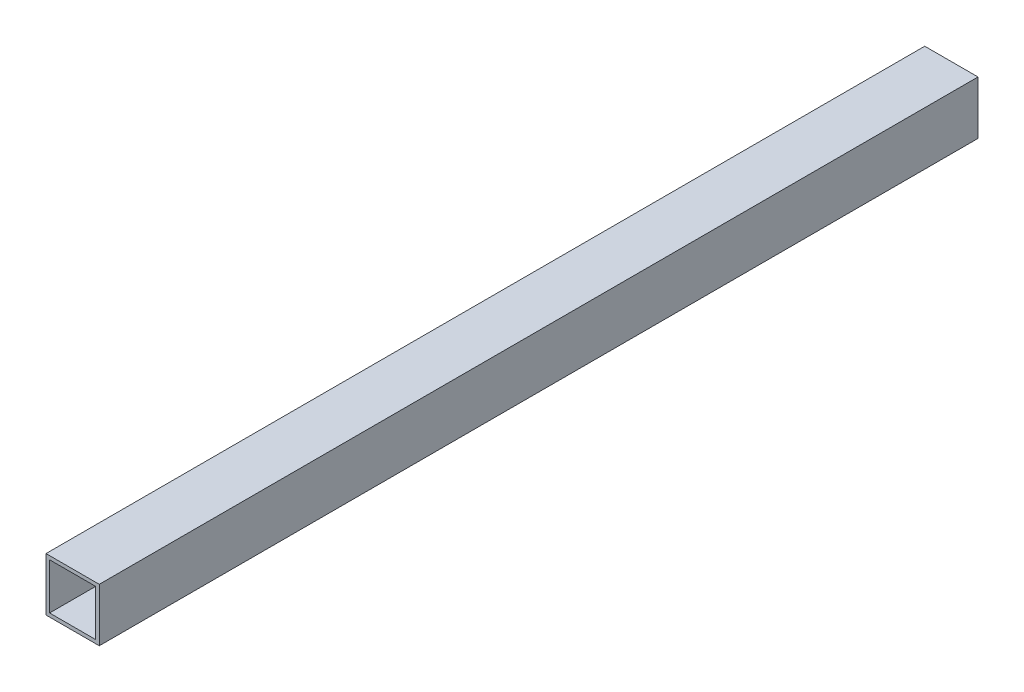
ISO-10303-21;
HEADER;
FILE_DESCRIPTION(('STEP AP214'),'2;1');
FILE_NAME('part.step','',(''),(''),'','','');
FILE_SCHEMA(('AUTOMOTIVE_DESIGN { 1 0 10303 214 1 1 1 1 }'));
ENDSEC;
DATA;
#1=APPLICATION_CONTEXT('core data for automotive mechanical design processes');
#2=APPLICATION_PROTOCOL_DEFINITION('international standard','automotive_design',2000,#1);
#3=PRODUCT_CONTEXT('',#1,'mechanical');
#4=PRODUCT('Part','Part','',(#3));
#5=PRODUCT_RELATED_PRODUCT_CATEGORY('part','',(#4));
#6=PRODUCT_DEFINITION_FORMATION('','',#4);
#7=PRODUCT_DEFINITION_CONTEXT('part definition',#1,'design');
#8=PRODUCT_DEFINITION('design','',#6,#7);
#9=PRODUCT_DEFINITION_SHAPE('','',#8);
#10=(LENGTH_UNIT() NAMED_UNIT(*) SI_UNIT(.MILLI.,.METRE.));
#11=(NAMED_UNIT(*) PLANE_ANGLE_UNIT() SI_UNIT($,.RADIAN.));
#12=(NAMED_UNIT(*) SI_UNIT($,.STERADIAN.) SOLID_ANGLE_UNIT());
#13=UNCERTAINTY_MEASURE_WITH_UNIT(LENGTH_MEASURE(1.E-05),#10,'distance_accuracy_value','');
#14=(GEOMETRIC_REPRESENTATION_CONTEXT(3) GLOBAL_UNCERTAINTY_ASSIGNED_CONTEXT((#13)) GLOBAL_UNIT_ASSIGNED_CONTEXT((#10,
#11,#12)) REPRESENTATION_CONTEXT('',''));
#15=CARTESIAN_POINT('',(0.,0.,0.));
#16=DIRECTION('',(0.,0.,1.));
#17=DIRECTION('',(1.,0.,0.));
#18=AXIS2_PLACEMENT_3D('',#15,#16,#17);
#19=CARTESIAN_POINT('',(0.,0.,209.55));
#20=DIRECTION('',(0.,0.,-1.));
#21=DIRECTION('',(-1.,0.,0.));
#22=AXIS2_PLACEMENT_3D('',#19,#20,#21);
#23=PLANE('',#22);
#24=DIRECTION('',(0.,1.,0.));
#25=VECTOR('',#24,1.);
#26=CARTESIAN_POINT('',(12.7,-12.7,209.55));
#27=LINE('',#26,#25);
#28=CARTESIAN_POINT('',(12.7,-12.7,209.55));
#29=VERTEX_POINT('',#28);
#30=CARTESIAN_POINT('',(12.7,12.7,209.55));
#31=VERTEX_POINT('',#30);
#32=EDGE_CURVE('E135',#29,#31,#27,.T.);
#33=ORIENTED_EDGE('',*,*,#32,.T.);
#34=DIRECTION('',(-1.,0.,0.));
#35=VECTOR('',#34,1.);
#36=CARTESIAN_POINT('',(-12.7,12.7,209.55));
#37=LINE('',#36,#35);
#38=CARTESIAN_POINT('',(-12.7,12.7,209.55));
#39=VERTEX_POINT('',#38);
#40=EDGE_CURVE('E138',#31,#39,#37,.T.);
#41=ORIENTED_EDGE('',*,*,#40,.T.);
#42=DIRECTION('',(0.,-1.,0.));
#43=VECTOR('',#42,1.);
#44=CARTESIAN_POINT('',(-12.7,-12.7,209.55));
#45=LINE('',#44,#43);
#46=CARTESIAN_POINT('',(-12.7,-12.7,209.55));
#47=VERTEX_POINT('',#46);
#48=EDGE_CURVE('E141',#39,#47,#45,.T.);
#49=ORIENTED_EDGE('',*,*,#48,.T.);
#50=DIRECTION('',(1.,0.,0.));
#51=VECTOR('',#50,1.);
#52=CARTESIAN_POINT('',(-12.7,-12.7,209.55));
#53=LINE('',#52,#51);
#54=EDGE_CURVE('E143',#47,#29,#53,.T.);
#55=ORIENTED_EDGE('',*,*,#54,.T.);
#56=EDGE_LOOP('',(#33,#41,#49,#55));
#57=FACE_BOUND('',#56,.T.);
#58=DIRECTION('',(0.,-1.,0.));
#59=VECTOR('',#58,1.);
#60=CARTESIAN_POINT('',(-10.9855,-10.9855,209.55));
#61=LINE('',#60,#59);
#62=CARTESIAN_POINT('',(-10.9855,10.9855,209.55));
#63=VERTEX_POINT('',#62);
#64=CARTESIAN_POINT('',(-10.9855,-10.9855,209.55));
#65=VERTEX_POINT('',#64);
#66=EDGE_CURVE('E99',#63,#65,#61,.T.);
#67=ORIENTED_EDGE('',*,*,#66,.F.);
#68=DIRECTION('',(-1.,0.,0.));
#69=VECTOR('',#68,1.);
#70=CARTESIAN_POINT('',(-10.9855,10.9855,209.55));
#71=LINE('',#70,#69);
#72=CARTESIAN_POINT('',(10.9855,10.9855,209.55));
#73=VERTEX_POINT('',#72);
#74=EDGE_CURVE('E121',#73,#63,#71,.T.);
#75=ORIENTED_EDGE('',*,*,#74,.F.);
#76=DIRECTION('',(0.,1.,0.));
#77=VECTOR('',#76,1.);
#78=CARTESIAN_POINT('',(10.9855,-10.9855,209.55));
#79=LINE('',#78,#77);
#80=CARTESIAN_POINT('',(10.9855,-10.9855,209.55));
#81=VERTEX_POINT('',#80);
#82=EDGE_CURVE('E119',#81,#73,#79,.T.);
#83=ORIENTED_EDGE('',*,*,#82,.F.);
#84=DIRECTION('',(1.,0.,0.));
#85=VECTOR('',#84,1.);
#86=CARTESIAN_POINT('',(-10.9855,-10.9855,209.55));
#87=LINE('',#86,#85);
#88=EDGE_CURVE('E107',#65,#81,#87,.T.);
#89=ORIENTED_EDGE('',*,*,#88,.F.);
#90=EDGE_LOOP('',(#67,#75,#83,#89));
#91=FACE_BOUND('',#90,.T.);
#92=ADVANCED_FACE('F34',(#57,#91),#23,.F.);
#93=CARTESIAN_POINT('',(0.,0.,-209.55));
#94=DIRECTION('',(0.,0.,-1.));
#95=DIRECTION('',(-1.,0.,0.));
#96=AXIS2_PLACEMENT_3D('',#93,#94,#95);
#97=PLANE('',#96);
#98=DIRECTION('',(0.,1.,0.));
#99=VECTOR('',#98,1.);
#100=CARTESIAN_POINT('',(12.7,-12.7,-209.55));
#101=LINE('',#100,#99);
#102=CARTESIAN_POINT('',(12.7,-12.7,-209.55));
#103=VERTEX_POINT('',#102);
#104=CARTESIAN_POINT('',(12.7,12.7,-209.55));
#105=VERTEX_POINT('',#104);
#106=EDGE_CURVE('E115',#103,#105,#101,.T.);
#107=ORIENTED_EDGE('',*,*,#106,.F.);
#108=DIRECTION('',(1.,0.,0.));
#109=VECTOR('',#108,1.);
#110=CARTESIAN_POINT('',(-12.7,-12.7,-209.55));
#111=LINE('',#110,#109);
#112=CARTESIAN_POINT('',(-12.7,-12.7,-209.55));
#113=VERTEX_POINT('',#112);
#114=EDGE_CURVE('E139',#113,#103,#111,.T.);
#115=ORIENTED_EDGE('',*,*,#114,.F.);
#116=DIRECTION('',(0.,-1.,0.));
#117=VECTOR('',#116,1.);
#118=CARTESIAN_POINT('',(-12.7,-12.7,-209.55));
#119=LINE('',#118,#117);
#120=CARTESIAN_POINT('',(-12.7,12.7,-209.55));
#121=VERTEX_POINT('',#120);
#122=EDGE_CURVE('E150',#121,#113,#119,.T.);
#123=ORIENTED_EDGE('',*,*,#122,.F.);
#124=DIRECTION('',(-1.,0.,0.));
#125=VECTOR('',#124,1.);
#126=CARTESIAN_POINT('',(-12.7,12.7,-209.55));
#127=LINE('',#126,#125);
#128=EDGE_CURVE('E148',#105,#121,#127,.T.);
#129=ORIENTED_EDGE('',*,*,#128,.F.);
#130=EDGE_LOOP('',(#107,#115,#123,#129));
#131=FACE_BOUND('',#130,.T.);
#132=DIRECTION('',(-1.,0.,0.));
#133=VECTOR('',#132,1.);
#134=CARTESIAN_POINT('',(-10.9855,10.9855,-209.55));
#135=LINE('',#134,#133);
#136=CARTESIAN_POINT('',(10.9855,10.9855,-209.55));
#137=VERTEX_POINT('',#136);
#138=CARTESIAN_POINT('',(-10.9855,10.9855,-209.55));
#139=VERTEX_POINT('',#138);
#140=EDGE_CURVE('E108',#137,#139,#135,.T.);
#141=ORIENTED_EDGE('',*,*,#140,.T.);
#142=DIRECTION('',(0.,-1.,0.));
#143=VECTOR('',#142,1.);
#144=CARTESIAN_POINT('',(-10.9855,-10.9855,-209.55));
#145=LINE('',#144,#143);
#146=CARTESIAN_POINT('',(-10.9855,-10.9855,-209.55));
#147=VERTEX_POINT('',#146);
#148=EDGE_CURVE('E57',#139,#147,#145,.T.);
#149=ORIENTED_EDGE('',*,*,#148,.T.);
#150=DIRECTION('',(1.,0.,0.));
#151=VECTOR('',#150,1.);
#152=CARTESIAN_POINT('',(-10.9855,-10.9855,-209.55));
#153=LINE('',#152,#151);
#154=CARTESIAN_POINT('',(10.9855,-10.9855,-209.55));
#155=VERTEX_POINT('',#154);
#156=EDGE_CURVE('E114',#147,#155,#153,.T.);
#157=ORIENTED_EDGE('',*,*,#156,.T.);
#158=DIRECTION('',(0.,1.,0.));
#159=VECTOR('',#158,1.);
#160=CARTESIAN_POINT('',(10.9855,-10.9855,-209.55));
#161=LINE('',#160,#159);
#162=EDGE_CURVE('E127',#155,#137,#161,.T.);
#163=ORIENTED_EDGE('',*,*,#162,.T.);
#164=EDGE_LOOP('',(#141,#149,#157,#163));
#165=FACE_BOUND('',#164,.T.);
#166=ADVANCED_FACE('F168',(#131,#165),#97,.T.);
#167=CARTESIAN_POINT('',(12.7,-12.7,209.55));
#168=DIRECTION('',(-1.,0.,0.));
#169=DIRECTION('',(0.,0.,1.));
#170=AXIS2_PLACEMENT_3D('',#167,#168,#169);
#171=PLANE('',#170);
#172=ORIENTED_EDGE('',*,*,#106,.T.);
#173=DIRECTION('',(0.,0.,-1.));
#174=VECTOR('',#173,1.);
#175=CARTESIAN_POINT('',(12.7,12.7,209.55));
#176=LINE('',#175,#174);
#177=EDGE_CURVE('E11',#31,#105,#176,.T.);
#178=ORIENTED_EDGE('',*,*,#177,.F.);
#179=ORIENTED_EDGE('',*,*,#32,.F.);
#180=DIRECTION('',(0.,0.,-1.));
#181=VECTOR('',#180,1.);
#182=CARTESIAN_POINT('',(12.7,-12.7,209.55));
#183=LINE('',#182,#181);
#184=EDGE_CURVE('E145',#29,#103,#183,.T.);
#185=ORIENTED_EDGE('',*,*,#184,.T.);
#186=EDGE_LOOP('',(#172,#178,#179,#185));
#187=FACE_BOUND('',#186,.T.);
#188=ADVANCED_FACE('F36',(#187),#171,.F.);
#189=CARTESIAN_POINT('',(-12.7,12.7,209.55));
#190=DIRECTION('',(0.,-1.,0.));
#191=DIRECTION('',(0.,0.,-1.));
#192=AXIS2_PLACEMENT_3D('',#189,#190,#191);
#193=PLANE('',#192);
#194=ORIENTED_EDGE('',*,*,#128,.T.);
#195=DIRECTION('',(0.,0.,-1.));
#196=VECTOR('',#195,1.);
#197=CARTESIAN_POINT('',(-12.7,12.7,209.55));
#198=LINE('',#197,#196);
#199=EDGE_CURVE('E42',#39,#121,#198,.T.);
#200=ORIENTED_EDGE('',*,*,#199,.F.);
#201=ORIENTED_EDGE('',*,*,#40,.F.);
#202=ORIENTED_EDGE('',*,*,#177,.T.);
#203=EDGE_LOOP('',(#194,#200,#201,#202));
#204=FACE_BOUND('',#203,.T.);
#205=ADVANCED_FACE('F178',(#204),#193,.F.);
#206=CARTESIAN_POINT('',(-12.7,-12.7,209.55));
#207=DIRECTION('',(1.,0.,0.));
#208=DIRECTION('',(0.,0.,-1.));
#209=AXIS2_PLACEMENT_3D('',#206,#207,#208);
#210=PLANE('',#209);
#211=ORIENTED_EDGE('',*,*,#122,.T.);
#212=DIRECTION('',(0.,0.,-1.));
#213=VECTOR('',#212,1.);
#214=CARTESIAN_POINT('',(-12.7,-12.7,209.55));
#215=LINE('',#214,#213);
#216=EDGE_CURVE('E155',#47,#113,#215,.T.);
#217=ORIENTED_EDGE('',*,*,#216,.F.);
#218=ORIENTED_EDGE('',*,*,#48,.F.);
#219=ORIENTED_EDGE('',*,*,#199,.T.);
#220=EDGE_LOOP('',(#211,#217,#218,#219));
#221=FACE_BOUND('',#220,.T.);
#222=ADVANCED_FACE('F162',(#221),#210,.F.);
#223=CARTESIAN_POINT('',(-12.7,-12.7,209.55));
#224=DIRECTION('',(0.,1.,0.));
#225=DIRECTION('',(0.,0.,1.));
#226=AXIS2_PLACEMENT_3D('',#223,#224,#225);
#227=PLANE('',#226);
#228=ORIENTED_EDGE('',*,*,#114,.T.);
#229=ORIENTED_EDGE('',*,*,#184,.F.);
#230=ORIENTED_EDGE('',*,*,#54,.F.);
#231=ORIENTED_EDGE('',*,*,#216,.T.);
#232=EDGE_LOOP('',(#228,#229,#230,#231));
#233=FACE_BOUND('',#232,.T.);
#234=ADVANCED_FACE('F172',(#233),#227,.F.);
#235=CARTESIAN_POINT('',(-10.9855,-10.9855,209.55));
#236=DIRECTION('',(1.,0.,0.));
#237=DIRECTION('',(0.,0.,-1.));
#238=AXIS2_PLACEMENT_3D('',#235,#236,#237);
#239=PLANE('',#238);
#240=ORIENTED_EDGE('',*,*,#148,.F.);
#241=DIRECTION('',(0.,0.,-1.));
#242=VECTOR('',#241,1.);
#243=CARTESIAN_POINT('',(-10.9855,10.9855,209.55));
#244=LINE('',#243,#242);
#245=EDGE_CURVE('E103',#63,#139,#244,.T.);
#246=ORIENTED_EDGE('',*,*,#245,.F.);
#247=ORIENTED_EDGE('',*,*,#66,.T.);
#248=DIRECTION('',(0.,0.,-1.));
#249=VECTOR('',#248,1.);
#250=CARTESIAN_POINT('',(-10.9855,-10.9855,209.55));
#251=LINE('',#250,#249);
#252=EDGE_CURVE('E102',#65,#147,#251,.T.);
#253=ORIENTED_EDGE('',*,*,#252,.T.);
#254=EDGE_LOOP('',(#240,#246,#247,#253));
#255=FACE_BOUND('',#254,.T.);
#256=ADVANCED_FACE('F101',(#255),#239,.T.);
#257=CARTESIAN_POINT('',(-10.9855,-10.9855,209.55));
#258=DIRECTION('',(0.,1.,0.));
#259=DIRECTION('',(0.,0.,1.));
#260=AXIS2_PLACEMENT_3D('',#257,#258,#259);
#261=PLANE('',#260);
#262=ORIENTED_EDGE('',*,*,#156,.F.);
#263=ORIENTED_EDGE('',*,*,#252,.F.);
#264=ORIENTED_EDGE('',*,*,#88,.T.);
#265=DIRECTION('',(0.,0.,-1.));
#266=VECTOR('',#265,1.);
#267=CARTESIAN_POINT('',(10.9855,-10.9855,209.55));
#268=LINE('',#267,#266);
#269=EDGE_CURVE('E116',#81,#155,#268,.T.);
#270=ORIENTED_EDGE('',*,*,#269,.T.);
#271=EDGE_LOOP('',(#262,#263,#264,#270));
#272=FACE_BOUND('',#271,.T.);
#273=ADVANCED_FACE('F111',(#272),#261,.T.);
#274=CARTESIAN_POINT('',(10.9855,-10.9855,209.55));
#275=DIRECTION('',(-1.,0.,0.));
#276=DIRECTION('',(0.,0.,1.));
#277=AXIS2_PLACEMENT_3D('',#274,#275,#276);
#278=PLANE('',#277);
#279=ORIENTED_EDGE('',*,*,#162,.F.);
#280=ORIENTED_EDGE('',*,*,#269,.F.);
#281=ORIENTED_EDGE('',*,*,#82,.T.);
#282=DIRECTION('',(0.,0.,-1.));
#283=VECTOR('',#282,1.);
#284=CARTESIAN_POINT('',(10.9855,10.9855,209.55));
#285=LINE('',#284,#283);
#286=EDGE_CURVE('E49',#73,#137,#285,.T.);
#287=ORIENTED_EDGE('',*,*,#286,.T.);
#288=EDGE_LOOP('',(#279,#280,#281,#287));
#289=FACE_BOUND('',#288,.T.);
#290=ADVANCED_FACE('F201',(#289),#278,.T.);
#291=CARTESIAN_POINT('',(-10.9855,10.9855,209.55));
#292=DIRECTION('',(0.,-1.,0.));
#293=DIRECTION('',(0.,0.,-1.));
#294=AXIS2_PLACEMENT_3D('',#291,#292,#293);
#295=PLANE('',#294);
#296=ORIENTED_EDGE('',*,*,#140,.F.);
#297=ORIENTED_EDGE('',*,*,#286,.F.);
#298=ORIENTED_EDGE('',*,*,#74,.T.);
#299=ORIENTED_EDGE('',*,*,#245,.T.);
#300=EDGE_LOOP('',(#296,#297,#298,#299));
#301=FACE_BOUND('',#300,.T.);
#302=ADVANCED_FACE('F205',(#301),#295,.T.);
#303=CLOSED_SHELL('',(#92,#166,#188,#205,#222,#234,#256,#273,#290,#302));
#304=MANIFOLD_SOLID_BREP('B2',#303);
#305=ADVANCED_BREP_SHAPE_REPRESENTATION('',(#18,#304),#14);
#306=SHAPE_DEFINITION_REPRESENTATION(#9,#305);
ENDSEC;
END-ISO-10303-21;
